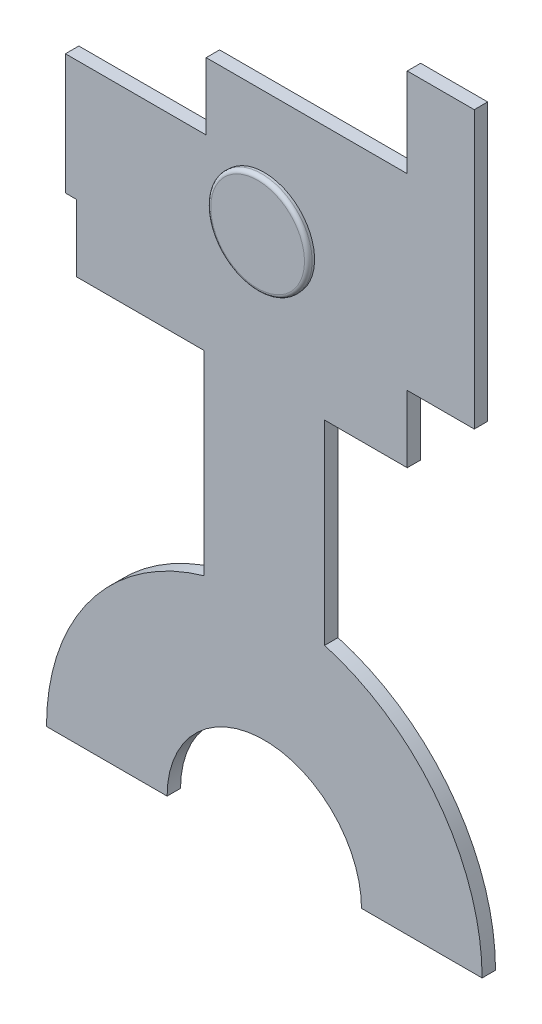
ISO-10303-21;
HEADER;
FILE_DESCRIPTION(('STEP AP214'),'2;1');
FILE_NAME('part.step','',(''),(''),'','','');
FILE_SCHEMA(('AUTOMOTIVE_DESIGN { 1 0 10303 214 1 1 1 1 }'));
ENDSEC;
DATA;
#1=APPLICATION_CONTEXT('core data for automotive mechanical design processes');
#2=APPLICATION_PROTOCOL_DEFINITION('international standard','automotive_design',2000,#1);
#3=PRODUCT_CONTEXT('',#1,'mechanical');
#4=PRODUCT('Part','Part','',(#3));
#5=PRODUCT_RELATED_PRODUCT_CATEGORY('part','',(#4));
#6=PRODUCT_DEFINITION_FORMATION('','',#4);
#7=PRODUCT_DEFINITION_CONTEXT('part definition',#1,'design');
#8=PRODUCT_DEFINITION('design','',#6,#7);
#9=PRODUCT_DEFINITION_SHAPE('','',#8);
#10=(LENGTH_UNIT() NAMED_UNIT(*) SI_UNIT(.MILLI.,.METRE.));
#11=(NAMED_UNIT(*) PLANE_ANGLE_UNIT() SI_UNIT($,.RADIAN.));
#12=(NAMED_UNIT(*) SI_UNIT($,.STERADIAN.) SOLID_ANGLE_UNIT());
#13=UNCERTAINTY_MEASURE_WITH_UNIT(LENGTH_MEASURE(1.E-05),#10,'distance_accuracy_value','');
#14=(GEOMETRIC_REPRESENTATION_CONTEXT(3) GLOBAL_UNCERTAINTY_ASSIGNED_CONTEXT((#13)) GLOBAL_UNIT_ASSIGNED_CONTEXT((#10,
#11,#12)) REPRESENTATION_CONTEXT('',''));
#15=CARTESIAN_POINT('',(0.,0.,0.));
#16=DIRECTION('',(0.,0.,1.));
#17=DIRECTION('',(1.,0.,0.));
#18=AXIS2_PLACEMENT_3D('',#15,#16,#17);
#19=CARTESIAN_POINT('',(0.02314459476911,-0.289438828022,0.));
#20=DIRECTION('',(0.,0.,1.));
#21=DIRECTION('',(1.,0.,0.));
#22=AXIS2_PLACEMENT_3D('',#19,#20,#21);
#23=PLANE('',#22);
#24=DIRECTION('',(0.,1.,0.));
#25=VECTOR('',#24,1.);
#26=CARTESIAN_POINT('',(0.08999999938109,-0.491142284843,0.));
#27=LINE('',#26,#25);
#28=CARTESIAN_POINT('',(0.08999999938109,-0.491142284843,0.));
#29=VERTEX_POINT('',#28);
#30=CARTESIAN_POINT('',(0.08999999938109,-0.2,0.));
#31=VERTEX_POINT('',#30);
#32=EDGE_CURVE('E310',#29,#31,#27,.T.);
#33=ORIENTED_EDGE('',*,*,#32,.F.);
#34=CARTESIAN_POINT('',(0.,-0.803432214414,0.));
#35=DIRECTION('',(0.,0.,1.));
#36=DIRECTION('',(1.,0.,0.));
#37=AXIS2_PLACEMENT_3D('',#34,#35,#36);
#38=CIRCLE('',#37,0.325);
#39=CARTESIAN_POINT('',(0.325,-0.803432213841,0.));
#40=VERTEX_POINT('',#39);
#41=EDGE_CURVE('E319',#40,#29,#38,.T.);
#42=ORIENTED_EDGE('',*,*,#41,.F.);
#43=DIRECTION('',(1.,0.,0.));
#44=VECTOR('',#43,1.);
#45=CARTESIAN_POINT('',(0.145,-0.803432213841,0.));
#46=LINE('',#45,#44);
#47=CARTESIAN_POINT('',(0.145,-0.803432213841,0.));
#48=VERTEX_POINT('',#47);
#49=EDGE_CURVE('E279',#48,#40,#46,.T.);
#50=ORIENTED_EDGE('',*,*,#49,.F.);
#51=CARTESIAN_POINT('',(0.,-0.803432214414,0.));
#52=DIRECTION('',(0.,0.,1.));
#53=DIRECTION('',(1.,0.,0.));
#54=AXIS2_PLACEMENT_3D('',#51,#52,#53);
#55=CIRCLE('',#54,0.145);
#56=CARTESIAN_POINT('',(-0.145,-0.803432213841,0.));
#57=VERTEX_POINT('',#56);
#58=EDGE_CURVE('E295',#48,#57,#55,.T.);
#59=ORIENTED_EDGE('',*,*,#58,.T.);
#60=DIRECTION('',(-1.,0.,0.));
#61=VECTOR('',#60,1.);
#62=CARTESIAN_POINT('',(-0.145,-0.803432213841,0.));
#63=LINE('',#62,#61);
#64=CARTESIAN_POINT('',(-0.325,-0.803432213841,0.));
#65=VERTEX_POINT('',#64);
#66=EDGE_CURVE('E265',#57,#65,#63,.T.);
#67=ORIENTED_EDGE('',*,*,#66,.T.);
#68=CARTESIAN_POINT('',(0.,-0.803432214414,0.));
#69=DIRECTION('',(0.,0.,1.));
#70=DIRECTION('',(1.,0.,0.));
#71=AXIS2_PLACEMENT_3D('',#68,#69,#70);
#72=CIRCLE('',#71,0.325);
#73=CARTESIAN_POINT('',(-0.09,-0.491142285021,0.));
#74=VERTEX_POINT('',#73);
#75=EDGE_CURVE('E340',#74,#65,#72,.T.);
#76=ORIENTED_EDGE('',*,*,#75,.F.);
#77=DIRECTION('',(0.,-1.,0.));
#78=VECTOR('',#77,1.);
#79=CARTESIAN_POINT('',(-0.09,-0.2,0.));
#80=LINE('',#79,#78);
#81=CARTESIAN_POINT('',(-0.09,-0.2,0.));
#82=VERTEX_POINT('',#81);
#83=EDGE_CURVE('E375',#82,#74,#80,.T.);
#84=ORIENTED_EDGE('',*,*,#83,.F.);
#85=DIRECTION('',(-1.,0.,0.));
#86=VECTOR('',#85,1.);
#87=CARTESIAN_POINT('',(-0.09,-0.2,0.));
#88=LINE('',#87,#86);
#89=CARTESIAN_POINT('',(-0.28,-0.2,0.));
#90=VERTEX_POINT('',#89);
#91=EDGE_CURVE('E380',#82,#90,#88,.T.);
#92=ORIENTED_EDGE('',*,*,#91,.T.);
#93=DIRECTION('',(0.,1.,0.));
#94=VECTOR('',#93,1.);
#95=CARTESIAN_POINT('',(-0.28,-0.2,0.));
#96=LINE('',#95,#94);
#97=CARTESIAN_POINT('',(-0.28,-0.1,0.));
#98=VERTEX_POINT('',#97);
#99=EDGE_CURVE('E221',#90,#98,#96,.T.);
#100=ORIENTED_EDGE('',*,*,#99,.T.);
#101=DIRECTION('',(-1.,0.,0.));
#102=VECTOR('',#101,1.);
#103=CARTESIAN_POINT('',(-0.28,-0.1,0.));
#104=LINE('',#103,#102);
#105=CARTESIAN_POINT('',(-0.296732,-0.1,0.));
#106=VERTEX_POINT('',#105);
#107=EDGE_CURVE('E383',#98,#106,#104,.T.);
#108=ORIENTED_EDGE('',*,*,#107,.T.);
#109=DIRECTION('',(0.,1.,0.));
#110=VECTOR('',#109,1.);
#111=CARTESIAN_POINT('',(-0.296732,-0.1,0.));
#112=LINE('',#111,#110);
#113=CARTESIAN_POINT('',(-0.296732,0.08,0.));
#114=VERTEX_POINT('',#113);
#115=EDGE_CURVE('E11',#106,#114,#112,.T.);
#116=ORIENTED_EDGE('',*,*,#115,.T.);
#117=DIRECTION('',(1.,0.,0.));
#118=VECTOR('',#117,1.);
#119=CARTESIAN_POINT('',(-0.296732,0.08,0.));
#120=LINE('',#119,#118);
#121=CARTESIAN_POINT('',(-0.08673200000014,0.08,0.));
#122=VERTEX_POINT('',#121);
#123=EDGE_CURVE('E26',#114,#122,#120,.T.);
#124=ORIENTED_EDGE('',*,*,#123,.T.);
#125=DIRECTION('',(0.,1.,0.));
#126=VECTOR('',#125,1.);
#127=CARTESIAN_POINT('',(-0.08673200000014,0.08,0.));
#128=LINE('',#127,#126);
#129=CARTESIAN_POINT('',(-0.08673200000014,0.18,0.));
#130=VERTEX_POINT('',#129);
#131=EDGE_CURVE('E218',#122,#130,#128,.T.);
#132=ORIENTED_EDGE('',*,*,#131,.T.);
#133=DIRECTION('',(1.,0.,0.));
#134=VECTOR('',#133,1.);
#135=CARTESIAN_POINT('',(-0.08673200000014,0.18,0.));
#136=LINE('',#135,#134);
#137=CARTESIAN_POINT('',(0.213268,0.18,0.));
#138=VERTEX_POINT('',#137);
#139=EDGE_CURVE('E390',#130,#138,#136,.T.);
#140=ORIENTED_EDGE('',*,*,#139,.T.);
#141=DIRECTION('',(0.,1.,0.));
#142=VECTOR('',#141,1.);
#143=CARTESIAN_POINT('',(0.213268,0.18,0.));
#144=LINE('',#143,#142);
#145=CARTESIAN_POINT('',(0.213268,0.312752,0.));
#146=VERTEX_POINT('',#145);
#147=EDGE_CURVE('E327',#138,#146,#144,.T.);
#148=ORIENTED_EDGE('',*,*,#147,.T.);
#149=DIRECTION('',(1.,0.,0.));
#150=VECTOR('',#149,1.);
#151=CARTESIAN_POINT('',(0.213268,0.312752,0.));
#152=LINE('',#151,#150);
#153=CARTESIAN_POINT('',(0.313268,0.312752,0.));
#154=VERTEX_POINT('',#153);
#155=EDGE_CURVE('E367',#146,#154,#152,.T.);
#156=ORIENTED_EDGE('',*,*,#155,.T.);
#157=DIRECTION('',(0.,-1.,0.));
#158=VECTOR('',#157,1.);
#159=CARTESIAN_POINT('',(0.313268,0.312752,0.));
#160=LINE('',#159,#158);
#161=CARTESIAN_POINT('',(0.313268,-0.1,0.));
#162=VERTEX_POINT('',#161);
#163=EDGE_CURVE('E264',#154,#162,#160,.T.);
#164=ORIENTED_EDGE('',*,*,#163,.T.);
#165=DIRECTION('',(-1.,0.,0.));
#166=VECTOR('',#165,1.);
#167=CARTESIAN_POINT('',(0.313268,-0.1,0.));
#168=LINE('',#167,#166);
#169=CARTESIAN_POINT('',(0.213268,-0.1,0.));
#170=VERTEX_POINT('',#169);
#171=EDGE_CURVE('E294',#162,#170,#168,.T.);
#172=ORIENTED_EDGE('',*,*,#171,.T.);
#173=DIRECTION('',(0.,-1.,0.));
#174=VECTOR('',#173,1.);
#175=CARTESIAN_POINT('',(0.213268,-0.1,0.));
#176=LINE('',#175,#174);
#177=CARTESIAN_POINT('',(0.213268,-0.2,0.));
#178=VERTEX_POINT('',#177);
#179=EDGE_CURVE('E270',#170,#178,#176,.T.);
#180=ORIENTED_EDGE('',*,*,#179,.T.);
#181=DIRECTION('',(1.,0.,0.));
#182=VECTOR('',#181,1.);
#183=CARTESIAN_POINT('',(0.08999999938109,-0.2,0.));
#184=LINE('',#183,#182);
#185=EDGE_CURVE('E326',#31,#178,#184,.T.);
#186=ORIENTED_EDGE('',*,*,#185,.F.);
#187=EDGE_LOOP('',(#33,#42,#50,#59,#67,#76,#84,#92,#100,#108,#116,#124,#132,#140,#148,#156,#164,
#172,#180,#186));
#188=FACE_BOUND('',#187,.T.);
#189=ADVANCED_FACE('F17',(#188),#23,.F.);
#190=CARTESIAN_POINT('',(-0.296732,-0.1,0.));
#191=DIRECTION('',(-1.,0.,0.));
#192=DIRECTION('',(0.,0.,1.));
#193=AXIS2_PLACEMENT_3D('',#190,#191,#192);
#194=PLANE('',#193);
#195=DIRECTION('',(0.,0.,1.));
#196=VECTOR('',#195,1.);
#197=CARTESIAN_POINT('',(-0.296732,-0.1,0.));
#198=LINE('',#197,#196);
#199=CARTESIAN_POINT('',(-0.296732,-0.1,0.02));
#200=VERTEX_POINT('',#199);
#201=EDGE_CURVE('E20',#106,#200,#198,.T.);
#202=ORIENTED_EDGE('',*,*,#201,.T.);
#203=DIRECTION('',(0.,1.,0.));
#204=VECTOR('',#203,1.);
#205=CARTESIAN_POINT('',(-0.296732,-0.1,0.02));
#206=LINE('',#205,#204);
#207=CARTESIAN_POINT('',(-0.296732,0.08,0.02));
#208=VERTEX_POINT('',#207);
#209=EDGE_CURVE('E231',#200,#208,#206,.T.);
#210=ORIENTED_EDGE('',*,*,#209,.T.);
#211=DIRECTION('',(0.,0.,1.));
#212=VECTOR('',#211,1.);
#213=CARTESIAN_POINT('',(-0.296732,0.08,0.));
#214=LINE('',#213,#212);
#215=EDGE_CURVE('E226',#114,#208,#214,.T.);
#216=ORIENTED_EDGE('',*,*,#215,.F.);
#217=ORIENTED_EDGE('',*,*,#115,.F.);
#218=EDGE_LOOP('',(#202,#210,#216,#217));
#219=FACE_BOUND('',#218,.T.);
#220=ADVANCED_FACE('F486',(#219),#194,.T.);
#221=CARTESIAN_POINT('',(-0.296732,0.08,0.));
#222=DIRECTION('',(0.,1.,0.));
#223=DIRECTION('',(1.,0.,0.));
#224=AXIS2_PLACEMENT_3D('',#221,#222,#223);
#225=PLANE('',#224);
#226=ORIENTED_EDGE('',*,*,#215,.T.);
#227=DIRECTION('',(1.,0.,0.));
#228=VECTOR('',#227,1.);
#229=CARTESIAN_POINT('',(-0.296732,0.08,0.02));
#230=LINE('',#229,#228);
#231=CARTESIAN_POINT('',(-0.08673200000014,0.08,0.02));
#232=VERTEX_POINT('',#231);
#233=EDGE_CURVE('E224',#208,#232,#230,.T.);
#234=ORIENTED_EDGE('',*,*,#233,.T.);
#235=DIRECTION('',(0.,0.,1.));
#236=VECTOR('',#235,1.);
#237=CARTESIAN_POINT('',(-0.08673200000014,0.08,0.));
#238=LINE('',#237,#236);
#239=EDGE_CURVE('E211',#122,#232,#238,.T.);
#240=ORIENTED_EDGE('',*,*,#239,.F.);
#241=ORIENTED_EDGE('',*,*,#123,.F.);
#242=EDGE_LOOP('',(#226,#234,#240,#241));
#243=FACE_BOUND('',#242,.T.);
#244=ADVANCED_FACE('F225',(#243),#225,.T.);
#245=CARTESIAN_POINT('',(-0.28,-0.1,0.));
#246=DIRECTION('',(0.,-1.,0.));
#247=DIRECTION('',(0.,0.,-1.));
#248=AXIS2_PLACEMENT_3D('',#245,#246,#247);
#249=PLANE('',#248);
#250=DIRECTION('',(0.,0.,1.));
#251=VECTOR('',#250,1.);
#252=CARTESIAN_POINT('',(-0.28,-0.1,0.));
#253=LINE('',#252,#251);
#254=CARTESIAN_POINT('',(-0.28,-0.1,0.02));
#255=VERTEX_POINT('',#254);
#256=EDGE_CURVE('E357',#98,#255,#253,.T.);
#257=ORIENTED_EDGE('',*,*,#256,.T.);
#258=DIRECTION('',(-1.,0.,0.));
#259=VECTOR('',#258,1.);
#260=CARTESIAN_POINT('',(-0.28,-0.1,0.02));
#261=LINE('',#260,#259);
#262=EDGE_CURVE('E252',#255,#200,#261,.T.);
#263=ORIENTED_EDGE('',*,*,#262,.T.);
#264=ORIENTED_EDGE('',*,*,#201,.F.);
#265=ORIENTED_EDGE('',*,*,#107,.F.);
#266=EDGE_LOOP('',(#257,#263,#264,#265));
#267=FACE_BOUND('',#266,.T.);
#268=ADVANCED_FACE('F397',(#267),#249,.T.);
#269=CARTESIAN_POINT('',(-0.08673200000014,0.08,0.));
#270=DIRECTION('',(-1.,0.,0.));
#271=DIRECTION('',(0.,0.,1.));
#272=AXIS2_PLACEMENT_3D('',#269,#270,#271);
#273=PLANE('',#272);
#274=ORIENTED_EDGE('',*,*,#239,.T.);
#275=DIRECTION('',(0.,1.,0.));
#276=VECTOR('',#275,1.);
#277=CARTESIAN_POINT('',(-0.08673200000014,0.08,0.02));
#278=LINE('',#277,#276);
#279=CARTESIAN_POINT('',(-0.08673200000014,0.18,0.02));
#280=VERTEX_POINT('',#279);
#281=EDGE_CURVE('E216',#232,#280,#278,.T.);
#282=ORIENTED_EDGE('',*,*,#281,.T.);
#283=DIRECTION('',(0.,0.,1.));
#284=VECTOR('',#283,1.);
#285=CARTESIAN_POINT('',(-0.08673200000014,0.18,0.));
#286=LINE('',#285,#284);
#287=EDGE_CURVE('E387',#130,#280,#286,.T.);
#288=ORIENTED_EDGE('',*,*,#287,.F.);
#289=ORIENTED_EDGE('',*,*,#131,.F.);
#290=EDGE_LOOP('',(#274,#282,#288,#289));
#291=FACE_BOUND('',#290,.T.);
#292=ADVANCED_FACE('F213',(#291),#273,.T.);
#293=CARTESIAN_POINT('',(-0.28,-0.2,0.));
#294=DIRECTION('',(-1.,0.,0.));
#295=DIRECTION('',(0.,0.,1.));
#296=AXIS2_PLACEMENT_3D('',#293,#294,#295);
#297=PLANE('',#296);
#298=DIRECTION('',(0.,0.,1.));
#299=VECTOR('',#298,1.);
#300=CARTESIAN_POINT('',(-0.28,-0.2,0.));
#301=LINE('',#300,#299);
#302=CARTESIAN_POINT('',(-0.28,-0.2,0.02));
#303=VERTEX_POINT('',#302);
#304=EDGE_CURVE('E330',#90,#303,#301,.T.);
#305=ORIENTED_EDGE('',*,*,#304,.T.);
#306=DIRECTION('',(0.,1.,0.));
#307=VECTOR('',#306,1.);
#308=CARTESIAN_POINT('',(-0.28,-0.2,0.02));
#309=LINE('',#308,#307);
#310=EDGE_CURVE('E256',#303,#255,#309,.T.);
#311=ORIENTED_EDGE('',*,*,#310,.T.);
#312=ORIENTED_EDGE('',*,*,#256,.F.);
#313=ORIENTED_EDGE('',*,*,#99,.F.);
#314=EDGE_LOOP('',(#305,#311,#312,#313));
#315=FACE_BOUND('',#314,.T.);
#316=ADVANCED_FACE('F402',(#315),#297,.T.);
#317=CARTESIAN_POINT('',(-0.08673200000014,0.18,0.));
#318=DIRECTION('',(0.,1.,0.));
#319=DIRECTION('',(1.,0.,0.));
#320=AXIS2_PLACEMENT_3D('',#317,#318,#319);
#321=PLANE('',#320);
#322=ORIENTED_EDGE('',*,*,#287,.T.);
#323=DIRECTION('',(1.,0.,0.));
#324=VECTOR('',#323,1.);
#325=CARTESIAN_POINT('',(-0.08673200000014,0.18,0.02));
#326=LINE('',#325,#324);
#327=CARTESIAN_POINT('',(0.213268,0.18,0.02));
#328=VERTEX_POINT('',#327);
#329=EDGE_CURVE('E237',#280,#328,#326,.T.);
#330=ORIENTED_EDGE('',*,*,#329,.T.);
#331=DIRECTION('',(0.,0.,1.));
#332=VECTOR('',#331,1.);
#333=CARTESIAN_POINT('',(0.213268,0.18,0.));
#334=LINE('',#333,#332);
#335=EDGE_CURVE('E331',#138,#328,#334,.T.);
#336=ORIENTED_EDGE('',*,*,#335,.F.);
#337=ORIENTED_EDGE('',*,*,#139,.F.);
#338=EDGE_LOOP('',(#322,#330,#336,#337));
#339=FACE_BOUND('',#338,.T.);
#340=ADVANCED_FACE('F482',(#339),#321,.T.);
#341=CARTESIAN_POINT('',(-0.09,-0.2,0.));
#342=DIRECTION('',(0.,-1.,0.));
#343=DIRECTION('',(0.,0.,-1.));
#344=AXIS2_PLACEMENT_3D('',#341,#342,#343);
#345=PLANE('',#344);
#346=DIRECTION('',(0.,0.,1.));
#347=VECTOR('',#346,1.);
#348=CARTESIAN_POINT('',(-0.09,-0.2,0.));
#349=LINE('',#348,#347);
#350=CARTESIAN_POINT('',(-0.09,-0.2,0.02));
#351=VERTEX_POINT('',#350);
#352=EDGE_CURVE('E370',#82,#351,#349,.T.);
#353=ORIENTED_EDGE('',*,*,#352,.T.);
#354=DIRECTION('',(-1.,0.,0.));
#355=VECTOR('',#354,1.);
#356=CARTESIAN_POINT('',(-0.09,-0.2,0.02));
#357=LINE('',#356,#355);
#358=EDGE_CURVE('E260',#351,#303,#357,.T.);
#359=ORIENTED_EDGE('',*,*,#358,.T.);
#360=ORIENTED_EDGE('',*,*,#304,.F.);
#361=ORIENTED_EDGE('',*,*,#91,.F.);
#362=EDGE_LOOP('',(#353,#359,#360,#361));
#363=FACE_BOUND('',#362,.T.);
#364=ADVANCED_FACE('F507',(#363),#345,.T.);
#365=CARTESIAN_POINT('',(0.213268,0.18,0.));
#366=DIRECTION('',(-1.,0.,0.));
#367=DIRECTION('',(0.,0.,1.));
#368=AXIS2_PLACEMENT_3D('',#365,#366,#367);
#369=PLANE('',#368);
#370=ORIENTED_EDGE('',*,*,#335,.T.);
#371=DIRECTION('',(0.,1.,0.));
#372=VECTOR('',#371,1.);
#373=CARTESIAN_POINT('',(0.213268,0.18,0.02));
#374=LINE('',#373,#372);
#375=CARTESIAN_POINT('',(0.213268,0.312752,0.02));
#376=VERTEX_POINT('',#375);
#377=EDGE_CURVE('E244',#328,#376,#374,.T.);
#378=ORIENTED_EDGE('',*,*,#377,.T.);
#379=DIRECTION('',(0.,0.,1.));
#380=VECTOR('',#379,1.);
#381=CARTESIAN_POINT('',(0.213268,0.312752,0.));
#382=LINE('',#381,#380);
#383=EDGE_CURVE('E343',#146,#376,#382,.T.);
#384=ORIENTED_EDGE('',*,*,#383,.F.);
#385=ORIENTED_EDGE('',*,*,#147,.F.);
#386=EDGE_LOOP('',(#370,#378,#384,#385));
#387=FACE_BOUND('',#386,.T.);
#388=ADVANCED_FACE('F477',(#387),#369,.T.);
#389=CARTESIAN_POINT('',(-0.09,-0.2,0.));
#390=DIRECTION('',(1.,0.,0.));
#391=DIRECTION('',(0.,1.,0.));
#392=AXIS2_PLACEMENT_3D('',#389,#390,#391);
#393=PLANE('',#392);
#394=ORIENTED_EDGE('',*,*,#352,.F.);
#395=ORIENTED_EDGE('',*,*,#83,.T.);
#396=DIRECTION('',(0.,0.,1.));
#397=VECTOR('',#396,1.);
#398=CARTESIAN_POINT('',(-0.09,-0.491142285021,0.));
#399=LINE('',#398,#397);
#400=CARTESIAN_POINT('',(-0.09,-0.491142285021,0.02));
#401=VERTEX_POINT('',#400);
#402=EDGE_CURVE('E344',#74,#401,#399,.T.);
#403=ORIENTED_EDGE('',*,*,#402,.T.);
#404=DIRECTION('',(0.,-1.,0.));
#405=VECTOR('',#404,1.);
#406=CARTESIAN_POINT('',(-0.09,-0.2,0.02));
#407=LINE('',#406,#405);
#408=EDGE_CURVE('E269',#351,#401,#407,.T.);
#409=ORIENTED_EDGE('',*,*,#408,.F.);
#410=EDGE_LOOP('',(#394,#395,#403,#409));
#411=FACE_BOUND('',#410,.T.);
#412=ADVANCED_FACE('F501',(#411),#393,.F.);
#413=CARTESIAN_POINT('',(0.213268,0.312752,0.));
#414=DIRECTION('',(0.,1.,0.));
#415=DIRECTION('',(1.,0.,0.));
#416=AXIS2_PLACEMENT_3D('',#413,#414,#415);
#417=PLANE('',#416);
#418=ORIENTED_EDGE('',*,*,#383,.T.);
#419=DIRECTION('',(1.,0.,0.));
#420=VECTOR('',#419,1.);
#421=CARTESIAN_POINT('',(0.213268,0.312752,0.02));
#422=LINE('',#421,#420);
#423=CARTESIAN_POINT('',(0.313268,0.312752,0.02));
#424=VERTEX_POINT('',#423);
#425=EDGE_CURVE('E249',#376,#424,#422,.T.);
#426=ORIENTED_EDGE('',*,*,#425,.T.);
#427=DIRECTION('',(0.,0.,1.));
#428=VECTOR('',#427,1.);
#429=CARTESIAN_POINT('',(0.313268,0.312752,0.));
#430=LINE('',#429,#428);
#431=EDGE_CURVE('E261',#154,#424,#430,.T.);
#432=ORIENTED_EDGE('',*,*,#431,.F.);
#433=ORIENTED_EDGE('',*,*,#155,.F.);
#434=EDGE_LOOP('',(#418,#426,#432,#433));
#435=FACE_BOUND('',#434,.T.);
#436=ADVANCED_FACE('F474',(#435),#417,.T.);
#437=CARTESIAN_POINT('',(0.,-0.803432214414,0.));
#438=DIRECTION('',(0.,0.,-1.));
#439=DIRECTION('',(1.,0.,0.));
#440=AXIS2_PLACEMENT_3D('',#437,#438,#439);
#441=CYLINDRICAL_SURFACE('',#440,0.325);
#442=ORIENTED_EDGE('',*,*,#402,.F.);
#443=ORIENTED_EDGE('',*,*,#75,.T.);
#444=DIRECTION('',(0.,0.,1.));
#445=VECTOR('',#444,1.);
#446=CARTESIAN_POINT('',(-0.325,-0.803432213841,0.));
#447=LINE('',#446,#445);
#448=CARTESIAN_POINT('',(-0.325,-0.803432213841,0.02));
#449=VERTEX_POINT('',#448);
#450=EDGE_CURVE('E321',#65,#449,#447,.T.);
#451=ORIENTED_EDGE('',*,*,#450,.T.);
#452=CARTESIAN_POINT('',(0.,-0.803432214414,0.02));
#453=DIRECTION('',(0.,0.,1.));
#454=DIRECTION('',(1.,0.,0.));
#455=AXIS2_PLACEMENT_3D('',#452,#453,#454);
#456=CIRCLE('',#455,0.325);
#457=EDGE_CURVE('E278',#401,#449,#456,.T.);
#458=ORIENTED_EDGE('',*,*,#457,.F.);
#459=EDGE_LOOP('',(#442,#443,#451,#458));
#460=FACE_BOUND('',#459,.T.);
#461=ADVANCED_FACE('F562',(#460),#441,.T.);
#462=CARTESIAN_POINT('',(0.313268,0.312752,0.));
#463=DIRECTION('',(1.,0.,0.));
#464=DIRECTION('',(0.,1.,0.));
#465=AXIS2_PLACEMENT_3D('',#462,#463,#464);
#466=PLANE('',#465);
#467=ORIENTED_EDGE('',*,*,#431,.T.);
#468=DIRECTION('',(0.,-1.,0.));
#469=VECTOR('',#468,1.);
#470=CARTESIAN_POINT('',(0.313268,0.312752,0.02));
#471=LINE('',#470,#469);
#472=CARTESIAN_POINT('',(0.313268,-0.1,0.02));
#473=VERTEX_POINT('',#472);
#474=EDGE_CURVE('E248',#424,#473,#471,.T.);
#475=ORIENTED_EDGE('',*,*,#474,.T.);
#476=DIRECTION('',(0.,0.,1.));
#477=VECTOR('',#476,1.);
#478=CARTESIAN_POINT('',(0.313268,-0.1,0.));
#479=LINE('',#478,#477);
#480=EDGE_CURVE('E291',#162,#473,#479,.T.);
#481=ORIENTED_EDGE('',*,*,#480,.F.);
#482=ORIENTED_EDGE('',*,*,#163,.F.);
#483=EDGE_LOOP('',(#467,#475,#481,#482));
#484=FACE_BOUND('',#483,.T.);
#485=ADVANCED_FACE('F460',(#484),#466,.T.);
#486=CARTESIAN_POINT('',(-0.145,-0.803432213841,0.));
#487=DIRECTION('',(0.,-1.,0.));
#488=DIRECTION('',(0.,0.,-1.));
#489=AXIS2_PLACEMENT_3D('',#486,#487,#488);
#490=PLANE('',#489);
#491=DIRECTION('',(0.,0.,1.));
#492=VECTOR('',#491,1.);
#493=CARTESIAN_POINT('',(-0.145,-0.803432213841,0.));
#494=LINE('',#493,#492);
#495=CARTESIAN_POINT('',(-0.145,-0.803432213841,0.02));
#496=VERTEX_POINT('',#495);
#497=EDGE_CURVE('E273',#57,#496,#494,.T.);
#498=ORIENTED_EDGE('',*,*,#497,.T.);
#499=DIRECTION('',(-1.,0.,0.));
#500=VECTOR('',#499,1.);
#501=CARTESIAN_POINT('',(-0.145,-0.803432213841,0.02));
#502=LINE('',#501,#500);
#503=EDGE_CURVE('E286',#496,#449,#502,.T.);
#504=ORIENTED_EDGE('',*,*,#503,.T.);
#505=ORIENTED_EDGE('',*,*,#450,.F.);
#506=ORIENTED_EDGE('',*,*,#66,.F.);
#507=EDGE_LOOP('',(#498,#504,#505,#506));
#508=FACE_BOUND('',#507,.T.);
#509=ADVANCED_FACE('F500',(#508),#490,.T.);
#510=CARTESIAN_POINT('',(0.313268,-0.1,0.));
#511=DIRECTION('',(0.,-1.,0.));
#512=DIRECTION('',(0.,0.,-1.));
#513=AXIS2_PLACEMENT_3D('',#510,#511,#512);
#514=PLANE('',#513);
#515=ORIENTED_EDGE('',*,*,#480,.T.);
#516=DIRECTION('',(-1.,0.,0.));
#517=VECTOR('',#516,1.);
#518=CARTESIAN_POINT('',(0.313268,-0.1,0.02));
#519=LINE('',#518,#517);
#520=CARTESIAN_POINT('',(0.213268,-0.1,0.02));
#521=VERTEX_POINT('',#520);
#522=EDGE_CURVE('E447',#473,#521,#519,.T.);
#523=ORIENTED_EDGE('',*,*,#522,.T.);
#524=DIRECTION('',(0.,0.,1.));
#525=VECTOR('',#524,1.);
#526=CARTESIAN_POINT('',(0.213268,-0.1,0.));
#527=LINE('',#526,#525);
#528=EDGE_CURVE('E274',#170,#521,#527,.T.);
#529=ORIENTED_EDGE('',*,*,#528,.F.);
#530=ORIENTED_EDGE('',*,*,#171,.F.);
#531=EDGE_LOOP('',(#515,#523,#529,#530));
#532=FACE_BOUND('',#531,.T.);
#533=ADVANCED_FACE('F470',(#532),#514,.T.);
#534=CARTESIAN_POINT('',(0.,-0.803432214414,0.));
#535=DIRECTION('',(0.,0.,-1.));
#536=DIRECTION('',(1.,0.,0.));
#537=AXIS2_PLACEMENT_3D('',#534,#535,#536);
#538=CYLINDRICAL_SURFACE('',#537,0.145);
#539=DIRECTION('',(0.,0.,1.));
#540=VECTOR('',#539,1.);
#541=CARTESIAN_POINT('',(0.145,-0.803432213841,0.));
#542=LINE('',#541,#540);
#543=CARTESIAN_POINT('',(0.145,-0.803432213841,0.02));
#544=VERTEX_POINT('',#543);
#545=EDGE_CURVE('E282',#48,#544,#542,.T.);
#546=ORIENTED_EDGE('',*,*,#545,.T.);
#547=CARTESIAN_POINT('',(0.,-0.803432214414,0.02));
#548=DIRECTION('',(0.,0.,1.));
#549=DIRECTION('',(1.,0.,0.));
#550=AXIS2_PLACEMENT_3D('',#547,#548,#549);
#551=CIRCLE('',#550,0.145);
#552=EDGE_CURVE('E290',#544,#496,#551,.T.);
#553=ORIENTED_EDGE('',*,*,#552,.T.);
#554=ORIENTED_EDGE('',*,*,#497,.F.);
#555=ORIENTED_EDGE('',*,*,#58,.F.);
#556=EDGE_LOOP('',(#546,#553,#554,#555));
#557=FACE_BOUND('',#556,.T.);
#558=ADVANCED_FACE('F499',(#557),#538,.F.);
#559=CARTESIAN_POINT('',(0.213268,-0.1,0.));
#560=DIRECTION('',(1.,0.,0.));
#561=DIRECTION('',(0.,1.,0.));
#562=AXIS2_PLACEMENT_3D('',#559,#560,#561);
#563=PLANE('',#562);
#564=ORIENTED_EDGE('',*,*,#528,.T.);
#565=DIRECTION('',(0.,-1.,0.));
#566=VECTOR('',#565,1.);
#567=CARTESIAN_POINT('',(0.213268,-0.1,0.02));
#568=LINE('',#567,#566);
#569=CARTESIAN_POINT('',(0.213268,-0.2,0.02));
#570=VERTEX_POINT('',#569);
#571=EDGE_CURVE('E442',#521,#570,#568,.T.);
#572=ORIENTED_EDGE('',*,*,#571,.T.);
#573=DIRECTION('',(0.,0.,1.));
#574=VECTOR('',#573,1.);
#575=CARTESIAN_POINT('',(0.213268,-0.2,0.));
#576=LINE('',#575,#574);
#577=EDGE_CURVE('E335',#178,#570,#576,.T.);
#578=ORIENTED_EDGE('',*,*,#577,.F.);
#579=ORIENTED_EDGE('',*,*,#179,.F.);
#580=EDGE_LOOP('',(#564,#572,#578,#579));
#581=FACE_BOUND('',#580,.T.);
#582=ADVANCED_FACE('F467',(#581),#563,.T.);
#583=CARTESIAN_POINT('',(0.145,-0.803432213841,0.));
#584=DIRECTION('',(0.,1.,0.));
#585=DIRECTION('',(1.,0.,0.));
#586=AXIS2_PLACEMENT_3D('',#583,#584,#585);
#587=PLANE('',#586);
#588=ORIENTED_EDGE('',*,*,#545,.F.);
#589=ORIENTED_EDGE('',*,*,#49,.T.);
#590=DIRECTION('',(0.,0.,1.));
#591=VECTOR('',#590,1.);
#592=CARTESIAN_POINT('',(0.325,-0.803432213841,0.));
#593=LINE('',#592,#591);
#594=CARTESIAN_POINT('',(0.325,-0.803432213841,0.02));
#595=VERTEX_POINT('',#594);
#596=EDGE_CURVE('E317',#40,#595,#593,.T.);
#597=ORIENTED_EDGE('',*,*,#596,.T.);
#598=DIRECTION('',(1.,0.,0.));
#599=VECTOR('',#598,1.);
#600=CARTESIAN_POINT('',(0.145,-0.803432213841,0.02));
#601=LINE('',#600,#599);
#602=EDGE_CURVE('E299',#544,#595,#601,.T.);
#603=ORIENTED_EDGE('',*,*,#602,.F.);
#604=EDGE_LOOP('',(#588,#589,#597,#603));
#605=FACE_BOUND('',#604,.T.);
#606=ADVANCED_FACE('F605',(#605),#587,.F.);
#607=CARTESIAN_POINT('',(0.08999999938109,-0.2,0.));
#608=DIRECTION('',(0.,1.,0.));
#609=DIRECTION('',(1.,0.,0.));
#610=AXIS2_PLACEMENT_3D('',#607,#608,#609);
#611=PLANE('',#610);
#612=DIRECTION('',(0.,0.,1.));
#613=VECTOR('',#612,1.);
#614=CARTESIAN_POINT('',(0.08999999938109,-0.2,0.));
#615=LINE('',#614,#613);
#616=CARTESIAN_POINT('',(0.08999999938109,-0.2,0.02));
#617=VERTEX_POINT('',#616);
#618=EDGE_CURVE('E314',#31,#617,#615,.T.);
#619=ORIENTED_EDGE('',*,*,#618,.F.);
#620=ORIENTED_EDGE('',*,*,#185,.T.);
#621=ORIENTED_EDGE('',*,*,#577,.T.);
#622=DIRECTION('',(1.,0.,0.));
#623=VECTOR('',#622,1.);
#624=CARTESIAN_POINT('',(0.08999999938109,-0.2,0.02));
#625=LINE('',#624,#623);
#626=EDGE_CURVE('E435',#617,#570,#625,.T.);
#627=ORIENTED_EDGE('',*,*,#626,.F.);
#628=EDGE_LOOP('',(#619,#620,#621,#627));
#629=FACE_BOUND('',#628,.T.);
#630=ADVANCED_FACE('F612',(#629),#611,.F.);
#631=CARTESIAN_POINT('',(0.,-0.803432214414,0.));
#632=DIRECTION('',(0.,0.,-1.));
#633=DIRECTION('',(1.,0.,0.));
#634=AXIS2_PLACEMENT_3D('',#631,#632,#633);
#635=CYLINDRICAL_SURFACE('',#634,0.325);
#636=ORIENTED_EDGE('',*,*,#596,.F.);
#637=ORIENTED_EDGE('',*,*,#41,.T.);
#638=DIRECTION('',(0.,0.,1.));
#639=VECTOR('',#638,1.);
#640=CARTESIAN_POINT('',(0.08999999938109,-0.491142284843,0.));
#641=LINE('',#640,#639);
#642=CARTESIAN_POINT('',(0.08999999938109,-0.491142284843,0.02));
#643=VERTEX_POINT('',#642);
#644=EDGE_CURVE('E307',#29,#643,#641,.T.);
#645=ORIENTED_EDGE('',*,*,#644,.T.);
#646=CARTESIAN_POINT('',(0.,-0.803432214414,0.02));
#647=DIRECTION('',(0.,0.,1.));
#648=DIRECTION('',(1.,0.,0.));
#649=AXIS2_PLACEMENT_3D('',#646,#647,#648);
#650=CIRCLE('',#649,0.325);
#651=EDGE_CURVE('E303',#595,#643,#650,.T.);
#652=ORIENTED_EDGE('',*,*,#651,.F.);
#653=EDGE_LOOP('',(#636,#637,#645,#652));
#654=FACE_BOUND('',#653,.T.);
#655=ADVANCED_FACE('F621',(#654),#635,.T.);
#656=CARTESIAN_POINT('',(0.08999999938109,-0.491142284843,0.));
#657=DIRECTION('',(-1.,0.,0.));
#658=DIRECTION('',(0.,0.,1.));
#659=AXIS2_PLACEMENT_3D('',#656,#657,#658);
#660=PLANE('',#659);
#661=ORIENTED_EDGE('',*,*,#644,.F.);
#662=ORIENTED_EDGE('',*,*,#32,.T.);
#663=ORIENTED_EDGE('',*,*,#618,.T.);
#664=DIRECTION('',(0.,1.,0.));
#665=VECTOR('',#664,1.);
#666=CARTESIAN_POINT('',(0.08999999938109,-0.491142284843,0.02));
#667=LINE('',#666,#665);
#668=EDGE_CURVE('E432',#643,#617,#667,.T.);
#669=ORIENTED_EDGE('',*,*,#668,.F.);
#670=EDGE_LOOP('',(#661,#662,#663,#669));
#671=FACE_BOUND('',#670,.T.);
#672=ADVANCED_FACE('F630',(#671),#660,.F.);
#673=CARTESIAN_POINT('',(0.,0.,0.03));
#674=DIRECTION('',(0.,0.,1.));
#675=DIRECTION('',(1.,0.,0.));
#676=AXIS2_PLACEMENT_3D('',#673,#674,#675);
#677=PLANE('',#676);
#678=CARTESIAN_POINT('',(0.,0.,0.03));
#679=DIRECTION('',(0.,0.,1.));
#680=DIRECTION('',(1.,0.,0.));
#681=AXIS2_PLACEMENT_3D('',#678,#679,#680);
#682=CIRCLE('',#681,0.06987268987938);
#683=CARTESIAN_POINT('',(-0.06987268987938,0.,0.03));
#684=VERTEX_POINT('',#683);
#685=EDGE_CURVE('E425',#684,#684,#682,.T.);
#686=ORIENTED_EDGE('',*,*,#685,.T.);
#687=EDGE_LOOP('',(#686));
#688=FACE_BOUND('',#687,.T.);
#689=ADVANCED_FACE('F639',(#688),#677,.T.);
#690=CARTESIAN_POINT('',(0.02314459476911,-0.289438828022,0.02));
#691=DIRECTION('',(0.,0.,1.));
#692=DIRECTION('',(1.,0.,0.));
#693=AXIS2_PLACEMENT_3D('',#690,#691,#692);
#694=PLANE('',#693);
#695=CARTESIAN_POINT('',(0.,0.,0.02));
#696=DIRECTION('',(0.,0.,1.));
#697=DIRECTION('',(1.,0.,0.));
#698=AXIS2_PLACEMENT_3D('',#695,#696,#697);
#699=CIRCLE('',#698,0.075);
#700=CARTESIAN_POINT('',(-0.075,0.,0.02));
#701=VERTEX_POINT('',#700);
#702=EDGE_CURVE('E422',#701,#701,#699,.T.);
#703=ORIENTED_EDGE('',*,*,#702,.F.);
#704=EDGE_LOOP('',(#703));
#705=FACE_BOUND('',#704,.T.);
#706=ORIENTED_EDGE('',*,*,#668,.T.);
#707=ORIENTED_EDGE('',*,*,#626,.T.);
#708=ORIENTED_EDGE('',*,*,#571,.F.);
#709=ORIENTED_EDGE('',*,*,#522,.F.);
#710=ORIENTED_EDGE('',*,*,#474,.F.);
#711=ORIENTED_EDGE('',*,*,#425,.F.);
#712=ORIENTED_EDGE('',*,*,#377,.F.);
#713=ORIENTED_EDGE('',*,*,#329,.F.);
#714=ORIENTED_EDGE('',*,*,#281,.F.);
#715=ORIENTED_EDGE('',*,*,#233,.F.);
#716=ORIENTED_EDGE('',*,*,#209,.F.);
#717=ORIENTED_EDGE('',*,*,#262,.F.);
#718=ORIENTED_EDGE('',*,*,#310,.F.);
#719=ORIENTED_EDGE('',*,*,#358,.F.);
#720=ORIENTED_EDGE('',*,*,#408,.T.);
#721=ORIENTED_EDGE('',*,*,#457,.T.);
#722=ORIENTED_EDGE('',*,*,#503,.F.);
#723=ORIENTED_EDGE('',*,*,#552,.F.);
#724=ORIENTED_EDGE('',*,*,#602,.T.);
#725=ORIENTED_EDGE('',*,*,#651,.T.);
#726=EDGE_LOOP('',(#706,#707,#708,#709,#710,#711,#712,#713,#714,#715,#716,#717,#718,#719,#720,
#721,#722,#723,#724,#725));
#727=FACE_BOUND('',#726,.T.);
#728=ADVANCED_FACE('F234',(#705,#727),#694,.T.);
#729=CARTESIAN_POINT('',(0.,0.,0.0245));
#730=DIRECTION('',(0.,0.,1.));
#731=DIRECTION('',(1.,0.,0.));
#732=AXIS2_PLACEMENT_3D('',#729,#730,#731);
#733=TOROIDAL_SURFACE('',#732,0.06987268987938,0.0055);
#734=ORIENTED_EDGE('',*,*,#685,.F.);
#735=CARTESIAN_POINT('',(-0.06987268987938,0.,0.0245));
#736=DIRECTION('',(0.,-1.,0.));
#737=DIRECTION('',(-1.,0.,0.));
#738=AXIS2_PLACEMENT_3D('',#735,#736,#737);
#739=CIRCLE('',#738,0.0055);
#740=CARTESIAN_POINT('',(-0.075351760718883,0.,0.0240206434148897));
#741=VERTEX_POINT('',#740);
#742=EDGE_CURVE('E429',#684,#741,#739,.T.);
#743=ORIENTED_EDGE('',*,*,#742,.T.);
#744=CARTESIAN_POINT('',(0.,0.,0.02402064341489));
#745=DIRECTION('',(0.,0.,1.));
#746=DIRECTION('',(1.,0.,0.));
#747=AXIS2_PLACEMENT_3D('',#744,#745,#746);
#748=CIRCLE('',#747,0.07535176071888);
#749=EDGE_CURVE('E414',#741,#741,#748,.T.);
#750=ORIENTED_EDGE('',*,*,#749,.T.);
#751=ORIENTED_EDGE('',*,*,#742,.F.);
#752=EDGE_LOOP('',(#734,#743,#750,#751));
#753=FACE_BOUND('',#752,.T.);
#754=ADVANCED_FACE('F656',(#753),#733,.T.);
#755=CARTESIAN_POINT('',(0.,0.,0.02));
#756=DIRECTION('',(0.,0.,1.));
#757=DIRECTION('',(1.,0.,0.));
#758=AXIS2_PLACEMENT_3D('',#755,#756,#757);
#759=CONICAL_SURFACE('',#758,0.075,0.0872664625997201);
#760=ORIENTED_EDGE('',*,*,#749,.F.);
#761=DIRECTION('',(0.0871557427476617,0.,-0.996194698091745));
#762=VECTOR('',#761,1.);
#763=CARTESIAN_POINT('',(-0.075,0.,0.02));
#764=LINE('',#763,#762);
#765=EDGE_CURVE('E418',#741,#701,#764,.T.);
#766=ORIENTED_EDGE('',*,*,#765,.T.);
#767=ORIENTED_EDGE('',*,*,#702,.T.);
#768=ORIENTED_EDGE('',*,*,#765,.F.);
#769=EDGE_LOOP('',(#760,#766,#767,#768));
#770=FACE_BOUND('',#769,.T.);
#771=ADVANCED_FACE('F665',(#770),#759,.T.);
#772=CLOSED_SHELL('',(#189,#220,#244,#268,#292,#316,#340,#364,#388,#412,#436,#461,#485,#509,
#533,#558,#582,#606,#630,#655,#672,#689,#728,#754,#771));
#773=MANIFOLD_SOLID_BREP('B1',#772);
#774=ADVANCED_BREP_SHAPE_REPRESENTATION('',(#18,#773),#14);
#775=SHAPE_DEFINITION_REPRESENTATION(#9,#774);
ENDSEC;
END-ISO-10303-21;
